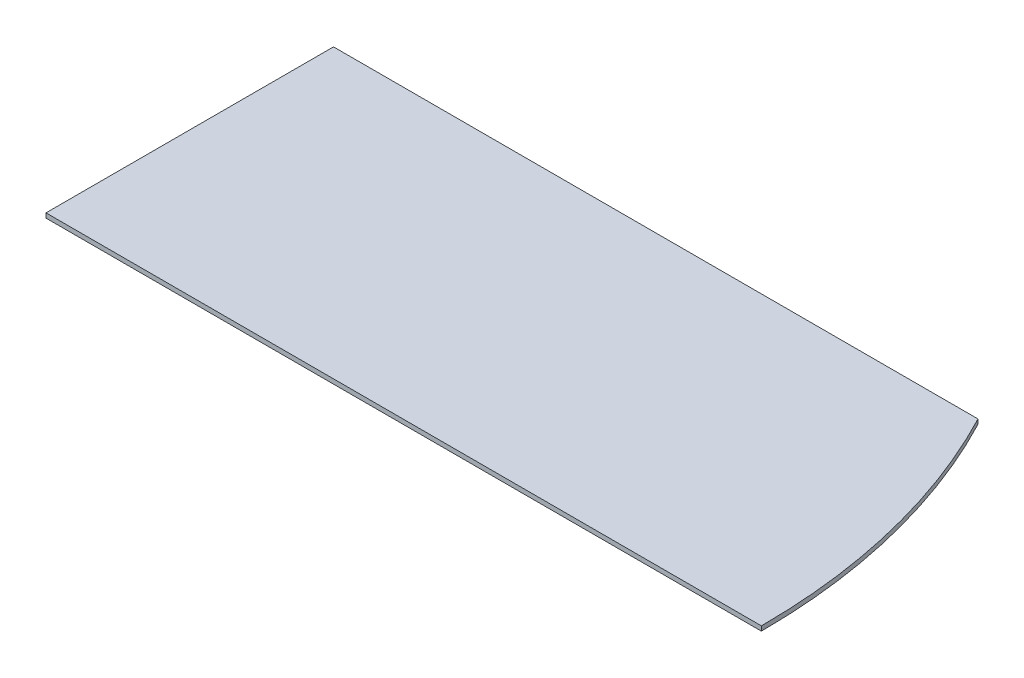
ISO-10303-21;
HEADER;
FILE_DESCRIPTION(('STEP AP214'),'2;1');
FILE_NAME('part.step','',(''),(''),'','','');
FILE_SCHEMA(('AUTOMOTIVE_DESIGN { 1 0 10303 214 1 1 1 1 }'));
ENDSEC;
DATA;
#1=APPLICATION_CONTEXT('core data for automotive mechanical design processes');
#2=APPLICATION_PROTOCOL_DEFINITION('international standard','automotive_design',2000,#1);
#3=PRODUCT_CONTEXT('',#1,'mechanical');
#4=PRODUCT('Part','Part','',(#3));
#5=PRODUCT_RELATED_PRODUCT_CATEGORY('part','',(#4));
#6=PRODUCT_DEFINITION_FORMATION('','',#4);
#7=PRODUCT_DEFINITION_CONTEXT('part definition',#1,'design');
#8=PRODUCT_DEFINITION('design','',#6,#7);
#9=PRODUCT_DEFINITION_SHAPE('','',#8);
#10=(LENGTH_UNIT() NAMED_UNIT(*) SI_UNIT(.MILLI.,.METRE.));
#11=(NAMED_UNIT(*) PLANE_ANGLE_UNIT() SI_UNIT($,.RADIAN.));
#12=(NAMED_UNIT(*) SI_UNIT($,.STERADIAN.) SOLID_ANGLE_UNIT());
#13=UNCERTAINTY_MEASURE_WITH_UNIT(LENGTH_MEASURE(1.E-05),#10,'distance_accuracy_value','');
#14=(GEOMETRIC_REPRESENTATION_CONTEXT(3) GLOBAL_UNCERTAINTY_ASSIGNED_CONTEXT((#13)) GLOBAL_UNIT_ASSIGNED_CONTEXT((#10,
#11,#12)) REPRESENTATION_CONTEXT('',''));
#15=CARTESIAN_POINT('',(0.,0.,0.));
#16=DIRECTION('',(0.,0.,1.));
#17=DIRECTION('',(1.,0.,0.));
#18=AXIS2_PLACEMENT_3D('',#15,#16,#17);
#19=CARTESIAN_POINT('',(0.,2.,0.));
#20=DIRECTION('',(1.,0.,0.));
#21=DIRECTION('',(0.,0.,-1.));
#22=AXIS2_PLACEMENT_3D('',#19,#20,#21);
#23=PLANE('',#22);
#24=DIRECTION('',(0.,0.,1.));
#25=VECTOR('',#24,1.);
#26=CARTESIAN_POINT('',(0.,0.,0.));
#27=LINE('',#26,#25);
#28=CARTESIAN_POINT('',(0.,0.,-125.));
#29=VERTEX_POINT('',#28);
#30=CARTESIAN_POINT('',(0.,0.,0.));
#31=VERTEX_POINT('',#30);
#32=EDGE_CURVE('E96',#29,#31,#27,.T.);
#33=ORIENTED_EDGE('',*,*,#32,.T.);
#34=DIRECTION('',(0.,-1.,0.));
#35=VECTOR('',#34,1.);
#36=CARTESIAN_POINT('',(0.,2.,0.));
#37=LINE('',#36,#35);
#38=CARTESIAN_POINT('',(0.,2.,0.));
#39=VERTEX_POINT('',#38);
#40=EDGE_CURVE('E11',#39,#31,#37,.T.);
#41=ORIENTED_EDGE('',*,*,#40,.F.);
#42=DIRECTION('',(0.,0.,1.));
#43=VECTOR('',#42,1.);
#44=CARTESIAN_POINT('',(0.,2.,0.));
#45=LINE('',#44,#43);
#46=CARTESIAN_POINT('',(0.,2.,-125.));
#47=VERTEX_POINT('',#46);
#48=EDGE_CURVE('E84',#47,#39,#45,.T.);
#49=ORIENTED_EDGE('',*,*,#48,.F.);
#50=DIRECTION('',(0.,-1.,0.));
#51=VECTOR('',#50,1.);
#52=CARTESIAN_POINT('',(0.,2.,-125.));
#53=LINE('',#52,#51);
#54=EDGE_CURVE('E92',#47,#29,#53,.T.);
#55=ORIENTED_EDGE('',*,*,#54,.T.);
#56=EDGE_LOOP('',(#33,#41,#49,#55));
#57=FACE_BOUND('',#56,.T.);
#58=ADVANCED_FACE('F33',(#57),#23,.F.);
#59=CARTESIAN_POINT('',(0.,2.,0.));
#60=DIRECTION('',(0.,0.,-1.));
#61=DIRECTION('',(-1.,0.,0.));
#62=AXIS2_PLACEMENT_3D('',#59,#60,#61);
#63=PLANE('',#62);
#64=DIRECTION('',(1.,0.,0.));
#65=VECTOR('',#64,1.);
#66=CARTESIAN_POINT('',(0.,0.,0.));
#67=LINE('',#66,#65);
#68=CARTESIAN_POINT('',(311.,0.,0.));
#69=VERTEX_POINT('',#68);
#70=EDGE_CURVE('E88',#31,#69,#67,.T.);
#71=ORIENTED_EDGE('',*,*,#70,.T.);
#72=DIRECTION('',(0.,-1.,0.));
#73=VECTOR('',#72,1.);
#74=CARTESIAN_POINT('',(311.,2.,0.));
#75=LINE('',#74,#73);
#76=CARTESIAN_POINT('',(311.,2.,0.));
#77=VERTEX_POINT('',#76);
#78=EDGE_CURVE('E41',#77,#69,#75,.T.);
#79=ORIENTED_EDGE('',*,*,#78,.F.);
#80=DIRECTION('',(1.,0.,0.));
#81=VECTOR('',#80,1.);
#82=CARTESIAN_POINT('',(0.,2.,0.));
#83=LINE('',#82,#81);
#84=EDGE_CURVE('E79',#39,#77,#83,.T.);
#85=ORIENTED_EDGE('',*,*,#84,.F.);
#86=ORIENTED_EDGE('',*,*,#40,.T.);
#87=EDGE_LOOP('',(#71,#79,#85,#86));
#88=FACE_BOUND('',#87,.T.);
#89=ADVANCED_FACE('F87',(#88),#63,.F.);
#90=CARTESIAN_POINT('',(42.,2.,0.));
#91=DIRECTION('',(0.,-1.,0.));
#92=DIRECTION('',(0.,0.,-1.));
#93=AXIS2_PLACEMENT_3D('',#90,#91,#92);
#94=CYLINDRICAL_SURFACE('',#93,269.);
#95=CARTESIAN_POINT('',(42.,0.,0.));
#96=DIRECTION('',(0.,1.,0.));
#97=DIRECTION('',(0.,0.,1.));
#98=AXIS2_PLACEMENT_3D('',#95,#96,#97);
#99=CIRCLE('',#98,269.);
#100=CARTESIAN_POINT('',(280.193198895351,0.,-125.));
#101=VERTEX_POINT('',#100);
#102=EDGE_CURVE('E66',#69,#101,#99,.T.);
#103=ORIENTED_EDGE('',*,*,#102,.T.);
#104=DIRECTION('',(0.,-1.,0.));
#105=VECTOR('',#104,1.);
#106=CARTESIAN_POINT('',(280.193198895351,2.,-125.));
#107=LINE('',#106,#105);
#108=CARTESIAN_POINT('',(280.193198895351,2.,-125.));
#109=VERTEX_POINT('',#108);
#110=EDGE_CURVE('E89',#109,#101,#107,.T.);
#111=ORIENTED_EDGE('',*,*,#110,.F.);
#112=CARTESIAN_POINT('',(42.,2.,0.));
#113=DIRECTION('',(0.,1.,0.));
#114=DIRECTION('',(0.,0.,1.));
#115=AXIS2_PLACEMENT_3D('',#112,#113,#114);
#116=CIRCLE('',#115,269.);
#117=EDGE_CURVE('E82',#77,#109,#116,.T.);
#118=ORIENTED_EDGE('',*,*,#117,.F.);
#119=ORIENTED_EDGE('',*,*,#78,.T.);
#120=EDGE_LOOP('',(#103,#111,#118,#119));
#121=FACE_BOUND('',#120,.T.);
#122=ADVANCED_FACE('F90',(#121),#94,.T.);
#123=CARTESIAN_POINT('',(0.,2.,-125.));
#124=DIRECTION('',(0.,0.,1.));
#125=DIRECTION('',(1.,0.,0.));
#126=AXIS2_PLACEMENT_3D('',#123,#124,#125);
#127=PLANE('',#126);
#128=DIRECTION('',(-1.,0.,0.));
#129=VECTOR('',#128,1.);
#130=CARTESIAN_POINT('',(0.,0.,-125.));
#131=LINE('',#130,#129);
#132=EDGE_CURVE('E72',#101,#29,#131,.T.);
#133=ORIENTED_EDGE('',*,*,#132,.T.);
#134=ORIENTED_EDGE('',*,*,#54,.F.);
#135=DIRECTION('',(-1.,0.,0.));
#136=VECTOR('',#135,1.);
#137=CARTESIAN_POINT('',(0.,2.,-125.));
#138=LINE('',#137,#136);
#139=EDGE_CURVE('E49',#109,#47,#138,.T.);
#140=ORIENTED_EDGE('',*,*,#139,.F.);
#141=ORIENTED_EDGE('',*,*,#110,.T.);
#142=EDGE_LOOP('',(#133,#134,#140,#141));
#143=FACE_BOUND('',#142,.T.);
#144=ADVANCED_FACE('F103',(#143),#127,.F.);
#145=CARTESIAN_POINT('',(42.,2.,0.));
#146=DIRECTION('',(0.,1.,0.));
#147=DIRECTION('',(0.,0.,1.));
#148=AXIS2_PLACEMENT_3D('',#145,#146,#147);
#149=PLANE('',#148);
#150=ORIENTED_EDGE('',*,*,#48,.T.);
#151=ORIENTED_EDGE('',*,*,#84,.T.);
#152=ORIENTED_EDGE('',*,*,#117,.T.);
#153=ORIENTED_EDGE('',*,*,#139,.T.);
#154=EDGE_LOOP('',(#150,#151,#152,#153));
#155=FACE_BOUND('',#154,.T.);
#156=ADVANCED_FACE('F80',(#155),#149,.T.);
#157=CARTESIAN_POINT('',(42.,0.,0.));
#158=DIRECTION('',(0.,1.,0.));
#159=DIRECTION('',(0.,0.,1.));
#160=AXIS2_PLACEMENT_3D('',#157,#158,#159);
#161=PLANE('',#160);
#162=ORIENTED_EDGE('',*,*,#32,.F.);
#163=ORIENTED_EDGE('',*,*,#132,.F.);
#164=ORIENTED_EDGE('',*,*,#102,.F.);
#165=ORIENTED_EDGE('',*,*,#70,.F.);
#166=EDGE_LOOP('',(#162,#163,#164,#165));
#167=FACE_BOUND('',#166,.T.);
#168=ADVANCED_FACE('F106',(#167),#161,.F.);
#169=CLOSED_SHELL('',(#58,#89,#122,#144,#156,#168));
#170=MANIFOLD_SOLID_BREP('B2',#169);
#171=ADVANCED_BREP_SHAPE_REPRESENTATION('',(#18,#170),#14);
#172=SHAPE_DEFINITION_REPRESENTATION(#9,#171);
ENDSEC;
END-ISO-10303-21;
